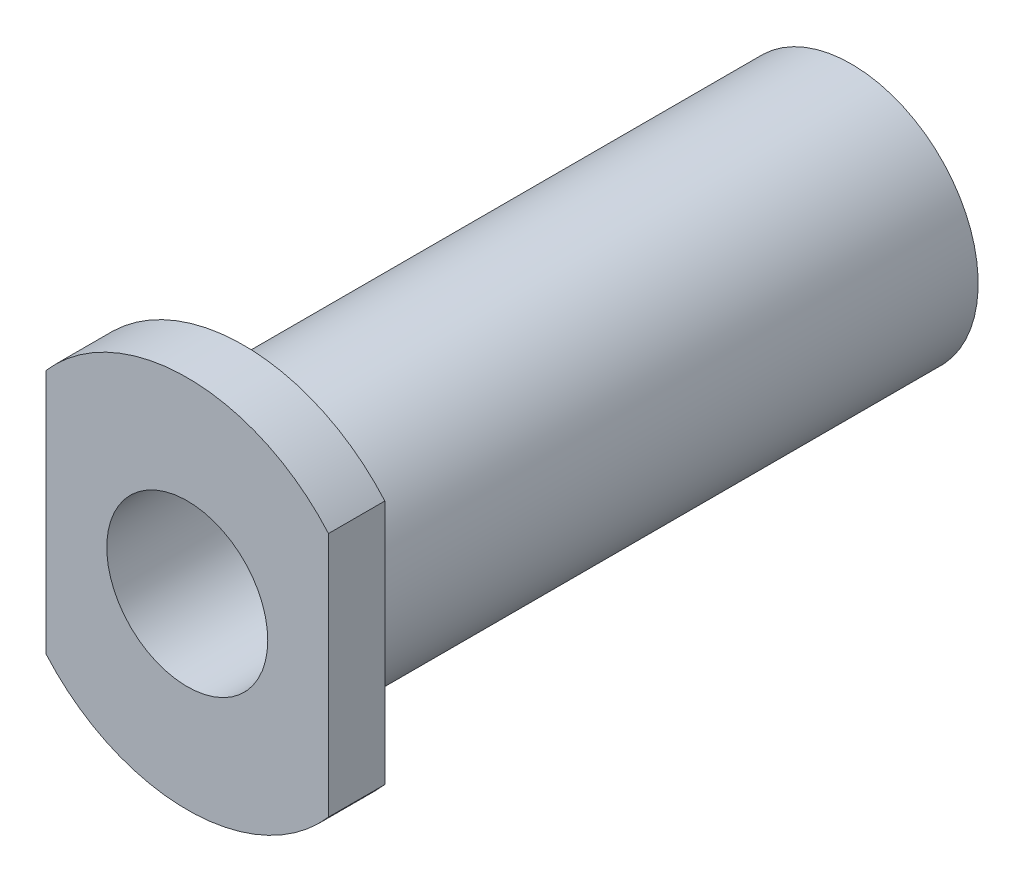
ISO-10303-21;
HEADER;
FILE_DESCRIPTION(('STEP AP214'),'2;1');
FILE_NAME('part.step','',(''),(''),'','','');
FILE_SCHEMA(('AUTOMOTIVE_DESIGN { 1 0 10303 214 1 1 1 1 }'));
ENDSEC;
DATA;
#1=APPLICATION_CONTEXT('core data for automotive mechanical design processes');
#2=APPLICATION_PROTOCOL_DEFINITION('international standard','automotive_design',2000,#1);
#3=PRODUCT_CONTEXT('',#1,'mechanical');
#4=PRODUCT('Part','Part','',(#3));
#5=PRODUCT_RELATED_PRODUCT_CATEGORY('part','',(#4));
#6=PRODUCT_DEFINITION_FORMATION('','',#4);
#7=PRODUCT_DEFINITION_CONTEXT('part definition',#1,'design');
#8=PRODUCT_DEFINITION('design','',#6,#7);
#9=PRODUCT_DEFINITION_SHAPE('','',#8);
#10=(LENGTH_UNIT() NAMED_UNIT(*) SI_UNIT(.MILLI.,.METRE.));
#11=(NAMED_UNIT(*) PLANE_ANGLE_UNIT() SI_UNIT($,.RADIAN.));
#12=(NAMED_UNIT(*) SI_UNIT($,.STERADIAN.) SOLID_ANGLE_UNIT());
#13=UNCERTAINTY_MEASURE_WITH_UNIT(LENGTH_MEASURE(1.E-05),#10,'distance_accuracy_value','');
#14=(GEOMETRIC_REPRESENTATION_CONTEXT(3) GLOBAL_UNCERTAINTY_ASSIGNED_CONTEXT((#13)) GLOBAL_UNIT_ASSIGNED_CONTEXT((#10,
#11,#12)) REPRESENTATION_CONTEXT('',''));
#15=CARTESIAN_POINT('',(0.,0.,0.));
#16=DIRECTION('',(0.,0.,1.));
#17=DIRECTION('',(1.,0.,0.));
#18=AXIS2_PLACEMENT_3D('',#15,#16,#17);
#19=CARTESIAN_POINT('',(35.093995480359,0.,-14.));
#20=DIRECTION('',(-1.,0.,0.));
#21=DIRECTION('',(0.,-1.,0.));
#22=AXIS2_PLACEMENT_3D('',#19,#20,#21);
#23=PLANE('',#22);
#24=DIRECTION('',(0.,-1.,0.));
#25=VECTOR('',#24,1.);
#26=CARTESIAN_POINT('',(35.093995480359,0.,0.));
#27=LINE('',#26,#25);
#28=CARTESIAN_POINT('',(35.093995480359,30.5067448480584,0.));
#29=VERTEX_POINT('',#28);
#30=CARTESIAN_POINT('',(35.093995480359,-30.5067448480584,0.));
#31=VERTEX_POINT('',#30);
#32=EDGE_CURVE('E118',#29,#31,#27,.T.);
#33=ORIENTED_EDGE('',*,*,#32,.T.);
#34=DIRECTION('',(0.,0.,1.));
#35=VECTOR('',#34,1.);
#36=CARTESIAN_POINT('',(35.093995480359,-30.5067448480584,-14.));
#37=LINE('',#36,#35);
#38=CARTESIAN_POINT('',(35.093995480359,-30.5067448480584,-14.));
#39=VERTEX_POINT('',#38);
#40=EDGE_CURVE('E57',#39,#31,#37,.T.);
#41=ORIENTED_EDGE('',*,*,#40,.F.);
#42=DIRECTION('',(0.,-1.,0.));
#43=VECTOR('',#42,1.);
#44=CARTESIAN_POINT('',(35.093995480359,0.,-14.));
#45=LINE('',#44,#43);
#46=CARTESIAN_POINT('',(35.093995480359,30.5067448480584,-14.));
#47=VERTEX_POINT('',#46);
#48=EDGE_CURVE('E66',#47,#39,#45,.T.);
#49=ORIENTED_EDGE('',*,*,#48,.F.);
#50=DIRECTION('',(0.,0.,1.));
#51=VECTOR('',#50,1.);
#52=CARTESIAN_POINT('',(35.093995480359,30.5067448480584,-14.));
#53=LINE('',#52,#51);
#54=EDGE_CURVE('E50',#47,#29,#53,.T.);
#55=ORIENTED_EDGE('',*,*,#54,.T.);
#56=EDGE_LOOP('',(#33,#41,#49,#55));
#57=FACE_BOUND('',#56,.T.);
#58=ADVANCED_FACE('F47',(#57),#23,.F.);
#59=CARTESIAN_POINT('',(0.,0.,-14.));
#60=DIRECTION('',(0.,0.,1.));
#61=DIRECTION('',(1.,0.,0.));
#62=AXIS2_PLACEMENT_3D('',#59,#60,#61);
#63=CYLINDRICAL_SURFACE('',#62,46.5);
#64=CARTESIAN_POINT('',(0.,0.,0.));
#65=DIRECTION('',(0.,0.,1.));
#66=DIRECTION('',(1.,0.,0.));
#67=AXIS2_PLACEMENT_3D('',#64,#65,#66);
#68=CIRCLE('',#67,46.5);
#69=CARTESIAN_POINT('',(-35.093995480359,-30.5067448480584,0.));
#70=VERTEX_POINT('',#69);
#71=EDGE_CURVE('E127',#70,#31,#68,.T.);
#72=ORIENTED_EDGE('',*,*,#71,.F.);
#73=DIRECTION('',(0.,0.,1.));
#74=VECTOR('',#73,1.);
#75=CARTESIAN_POINT('',(-35.093995480359,-30.5067448480584,-14.));
#76=LINE('',#75,#74);
#77=CARTESIAN_POINT('',(-35.093995480359,-30.5067448480584,-14.));
#78=VERTEX_POINT('',#77);
#79=EDGE_CURVE('E83',#78,#70,#76,.T.);
#80=ORIENTED_EDGE('',*,*,#79,.F.);
#81=CARTESIAN_POINT('',(0.,0.,-14.));
#82=DIRECTION('',(0.,0.,1.));
#83=DIRECTION('',(1.,0.,0.));
#84=AXIS2_PLACEMENT_3D('',#81,#82,#83);
#85=CIRCLE('',#84,46.5);
#86=EDGE_CURVE('E106',#78,#39,#85,.T.);
#87=ORIENTED_EDGE('',*,*,#86,.T.);
#88=ORIENTED_EDGE('',*,*,#40,.T.);
#89=EDGE_LOOP('',(#72,#80,#87,#88));
#90=FACE_BOUND('',#89,.T.);
#91=ADVANCED_FACE('F143',(#90),#63,.T.);
#92=CARTESIAN_POINT('',(-35.093995480359,0.,-14.));
#93=DIRECTION('',(-1.,0.,0.));
#94=DIRECTION('',(0.,-1.,0.));
#95=AXIS2_PLACEMENT_3D('',#92,#93,#94);
#96=PLANE('',#95);
#97=DIRECTION('',(0.,-1.,0.));
#98=VECTOR('',#97,1.);
#99=CARTESIAN_POINT('',(-35.093995480359,0.,0.));
#100=LINE('',#99,#98);
#101=CARTESIAN_POINT('',(-35.093995480359,30.5067448480584,0.));
#102=VERTEX_POINT('',#101);
#103=EDGE_CURVE('E101',#102,#70,#100,.T.);
#104=ORIENTED_EDGE('',*,*,#103,.F.);
#105=DIRECTION('',(0.,0.,1.));
#106=VECTOR('',#105,1.);
#107=CARTESIAN_POINT('',(-35.093995480359,30.5067448480584,-14.));
#108=LINE('',#107,#106);
#109=CARTESIAN_POINT('',(-35.093995480359,30.5067448480584,-14.));
#110=VERTEX_POINT('',#109);
#111=EDGE_CURVE('E97',#110,#102,#108,.T.);
#112=ORIENTED_EDGE('',*,*,#111,.F.);
#113=DIRECTION('',(0.,-1.,0.));
#114=VECTOR('',#113,1.);
#115=CARTESIAN_POINT('',(-35.093995480359,0.,-14.));
#116=LINE('',#115,#114);
#117=EDGE_CURVE('E100',#110,#78,#116,.T.);
#118=ORIENTED_EDGE('',*,*,#117,.T.);
#119=ORIENTED_EDGE('',*,*,#79,.T.);
#120=EDGE_LOOP('',(#104,#112,#118,#119));
#121=FACE_BOUND('',#120,.T.);
#122=ADVANCED_FACE('F99',(#121),#96,.T.);
#123=CARTESIAN_POINT('',(0.,0.,-14.));
#124=DIRECTION('',(0.,0.,1.));
#125=DIRECTION('',(1.,0.,0.));
#126=AXIS2_PLACEMENT_3D('',#123,#124,#125);
#127=CYLINDRICAL_SURFACE('',#126,46.5);
#128=CARTESIAN_POINT('',(0.,0.,0.));
#129=DIRECTION('',(0.,0.,1.));
#130=DIRECTION('',(1.,0.,0.));
#131=AXIS2_PLACEMENT_3D('',#128,#129,#130);
#132=CIRCLE('',#131,46.5);
#133=EDGE_CURVE('E121',#29,#102,#132,.T.);
#134=ORIENTED_EDGE('',*,*,#133,.F.);
#135=ORIENTED_EDGE('',*,*,#54,.F.);
#136=CARTESIAN_POINT('',(0.,0.,-14.));
#137=DIRECTION('',(0.,0.,1.));
#138=DIRECTION('',(1.,0.,0.));
#139=AXIS2_PLACEMENT_3D('',#136,#137,#138);
#140=CIRCLE('',#139,46.5);
#141=EDGE_CURVE('E105',#47,#110,#140,.T.);
#142=ORIENTED_EDGE('',*,*,#141,.T.);
#143=ORIENTED_EDGE('',*,*,#111,.T.);
#144=EDGE_LOOP('',(#134,#135,#142,#143));
#145=FACE_BOUND('',#144,.T.);
#146=ADVANCED_FACE('F109',(#145),#127,.T.);
#147=CARTESIAN_POINT('',(0.,0.,-14.));
#148=DIRECTION('',(0.,0.,1.));
#149=DIRECTION('',(1.,0.,0.));
#150=AXIS2_PLACEMENT_3D('',#147,#148,#149);
#151=CYLINDRICAL_SURFACE('',#150,20.);
#152=CARTESIAN_POINT('',(0.,0.,0.));
#153=DIRECTION('',(0.,0.,1.));
#154=DIRECTION('',(1.,0.,0.));
#155=AXIS2_PLACEMENT_3D('',#152,#153,#154);
#156=CIRCLE('',#155,20.);
#157=CARTESIAN_POINT('',(20.,0.,0.));
#158=VERTEX_POINT('',#157);
#159=EDGE_CURVE('E113',#158,#158,#156,.T.);
#160=ORIENTED_EDGE('',*,*,#159,.T.);
#161=EDGE_LOOP('',(#160));
#162=FACE_BOUND('',#161,.T.);
#163=CARTESIAN_POINT('',(0.,0.,-165.));
#164=DIRECTION('',(0.,0.,1.));
#165=DIRECTION('',(1.,0.,0.));
#166=AXIS2_PLACEMENT_3D('',#163,#164,#165);
#167=CIRCLE('',#166,20.);
#168=CARTESIAN_POINT('',(20.,0.,-165.));
#169=VERTEX_POINT('',#168);
#170=EDGE_CURVE('E171',#169,#169,#167,.T.);
#171=ORIENTED_EDGE('',*,*,#170,.F.);
#172=EDGE_LOOP('',(#171));
#173=FACE_BOUND('',#172,.T.);
#174=ADVANCED_FACE('F152',(#162,#173),#151,.F.);
#175=CARTESIAN_POINT('',(0.,0.,-14.));
#176=DIRECTION('',(0.,0.,1.));
#177=DIRECTION('',(1.,0.,0.));
#178=AXIS2_PLACEMENT_3D('',#175,#176,#177);
#179=PLANE('',#178);
#180=CARTESIAN_POINT('',(0.,0.,-14.));
#181=DIRECTION('',(0.,0.,-1.));
#182=DIRECTION('',(-1.,0.,0.));
#183=AXIS2_PLACEMENT_3D('',#180,#181,#182);
#184=CIRCLE('',#183,31.5);
#185=CARTESIAN_POINT('',(-31.5,0.,-14.));
#186=VERTEX_POINT('',#185);
#187=EDGE_CURVE('E11',#186,#186,#184,.T.);
#188=ORIENTED_EDGE('',*,*,#187,.F.);
#189=EDGE_LOOP('',(#188));
#190=FACE_BOUND('',#189,.T.);
#191=ORIENTED_EDGE('',*,*,#48,.T.);
#192=ORIENTED_EDGE('',*,*,#86,.F.);
#193=ORIENTED_EDGE('',*,*,#117,.F.);
#194=ORIENTED_EDGE('',*,*,#141,.F.);
#195=EDGE_LOOP('',(#191,#192,#193,#194));
#196=FACE_BOUND('',#195,.T.);
#197=ADVANCED_FACE('F104',(#190,#196),#179,.F.);
#198=CARTESIAN_POINT('',(0.,0.,0.));
#199=DIRECTION('',(0.,0.,1.));
#200=DIRECTION('',(1.,0.,0.));
#201=AXIS2_PLACEMENT_3D('',#198,#199,#200);
#202=PLANE('',#201);
#203=ORIENTED_EDGE('',*,*,#32,.F.);
#204=ORIENTED_EDGE('',*,*,#133,.T.);
#205=ORIENTED_EDGE('',*,*,#103,.T.);
#206=ORIENTED_EDGE('',*,*,#71,.T.);
#207=EDGE_LOOP('',(#203,#204,#205,#206));
#208=FACE_BOUND('',#207,.T.);
#209=ORIENTED_EDGE('',*,*,#159,.F.);
#210=EDGE_LOOP('',(#209));
#211=FACE_BOUND('',#210,.T.);
#212=ADVANCED_FACE('F141',(#208,#211),#202,.T.);
#213=CARTESIAN_POINT('',(0.,0.,-165.));
#214=DIRECTION('',(0.,0.,-1.));
#215=DIRECTION('',(-1.,0.,0.));
#216=AXIS2_PLACEMENT_3D('',#213,#214,#215);
#217=PLANE('',#216);
#218=ORIENTED_EDGE('',*,*,#170,.T.);
#219=EDGE_LOOP('',(#218));
#220=FACE_BOUND('',#219,.T.);
#221=CARTESIAN_POINT('',(0.,0.,-165.));
#222=DIRECTION('',(0.,0.,-1.));
#223=DIRECTION('',(-1.,0.,0.));
#224=AXIS2_PLACEMENT_3D('',#221,#222,#223);
#225=CIRCLE('',#224,31.5);
#226=CARTESIAN_POINT('',(-31.5,0.,-165.));
#227=VERTEX_POINT('',#226);
#228=EDGE_CURVE('E122',#227,#227,#225,.T.);
#229=ORIENTED_EDGE('',*,*,#228,.T.);
#230=EDGE_LOOP('',(#229));
#231=FACE_BOUND('',#230,.T.);
#232=ADVANCED_FACE('F180',(#220,#231),#217,.T.);
#233=CARTESIAN_POINT('',(0.,0.,-165.));
#234=DIRECTION('',(0.,0.,1.));
#235=DIRECTION('',(1.,0.,0.));
#236=AXIS2_PLACEMENT_3D('',#233,#234,#235);
#237=CYLINDRICAL_SURFACE('',#236,31.5);
#238=ORIENTED_EDGE('',*,*,#228,.F.);
#239=EDGE_LOOP('',(#238));
#240=FACE_BOUND('',#239,.T.);
#241=ORIENTED_EDGE('',*,*,#187,.T.);
#242=EDGE_LOOP('',(#241));
#243=FACE_BOUND('',#242,.T.);
#244=ADVANCED_FACE('F182',(#240,#243),#237,.T.);
#245=CLOSED_SHELL('',(#58,#91,#122,#146,#174,#197,#212,#232,#244));
#246=MANIFOLD_SOLID_BREP('B2',#245);
#247=ADVANCED_BREP_SHAPE_REPRESENTATION('',(#18,#246),#14);
#248=SHAPE_DEFINITION_REPRESENTATION(#9,#247);
ENDSEC;
END-ISO-10303-21;
